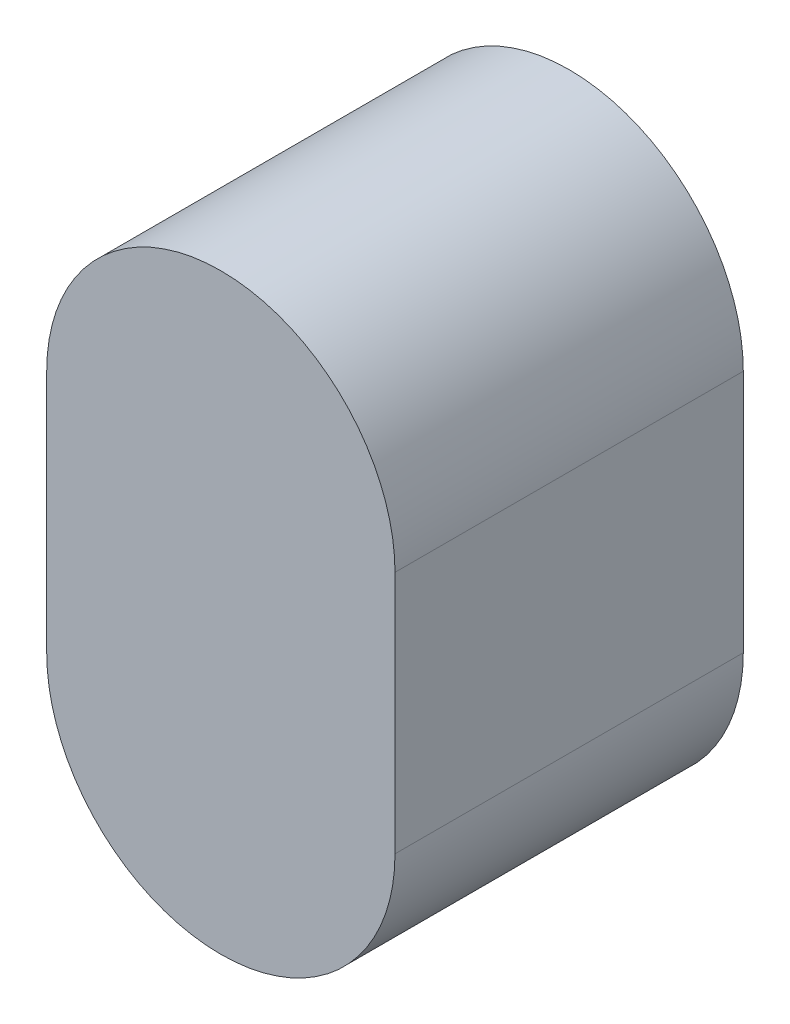
ISO-10303-21;
HEADER;
FILE_DESCRIPTION(('STEP AP214'),'2;1');
FILE_NAME('part.step','',(''),(''),'','','');
FILE_SCHEMA(('AUTOMOTIVE_DESIGN { 1 0 10303 214 1 1 1 1 }'));
ENDSEC;
DATA;
#1=APPLICATION_CONTEXT('core data for automotive mechanical design processes');
#2=APPLICATION_PROTOCOL_DEFINITION('international standard','automotive_design',2000,#1);
#3=PRODUCT_CONTEXT('',#1,'mechanical');
#4=PRODUCT('Part','Part','',(#3));
#5=PRODUCT_RELATED_PRODUCT_CATEGORY('part','',(#4));
#6=PRODUCT_DEFINITION_FORMATION('','',#4);
#7=PRODUCT_DEFINITION_CONTEXT('part definition',#1,'design');
#8=PRODUCT_DEFINITION('design','',#6,#7);
#9=PRODUCT_DEFINITION_SHAPE('','',#8);
#10=(LENGTH_UNIT() NAMED_UNIT(*) SI_UNIT(.MILLI.,.METRE.));
#11=(NAMED_UNIT(*) PLANE_ANGLE_UNIT() SI_UNIT($,.RADIAN.));
#12=(NAMED_UNIT(*) SI_UNIT($,.STERADIAN.) SOLID_ANGLE_UNIT());
#13=UNCERTAINTY_MEASURE_WITH_UNIT(LENGTH_MEASURE(1.E-05),#10,'distance_accuracy_value','');
#14=(GEOMETRIC_REPRESENTATION_CONTEXT(3) GLOBAL_UNCERTAINTY_ASSIGNED_CONTEXT((#13)) GLOBAL_UNIT_ASSIGNED_CONTEXT((#10,
#11,#12)) REPRESENTATION_CONTEXT('',''));
#15=CARTESIAN_POINT('',(0.,0.,0.));
#16=DIRECTION('',(0.,0.,1.));
#17=DIRECTION('',(1.,0.,0.));
#18=AXIS2_PLACEMENT_3D('',#15,#16,#17);
#19=CARTESIAN_POINT('',(0.,0.,5.));
#20=DIRECTION('',(0.,0.,-1.));
#21=DIRECTION('',(-1.,0.,0.));
#22=AXIS2_PLACEMENT_3D('',#19,#20,#21);
#23=CYLINDRICAL_SURFACE('',#22,2.5);
#24=CARTESIAN_POINT('',(0.,0.,0.));
#25=DIRECTION('',(0.,0.,1.));
#26=DIRECTION('',(1.,0.,0.));
#27=AXIS2_PLACEMENT_3D('',#24,#25,#26);
#28=CIRCLE('',#27,2.5);
#29=CARTESIAN_POINT('',(-2.5,0.,0.));
#30=VERTEX_POINT('',#29);
#31=CARTESIAN_POINT('',(2.5,0.,0.));
#32=VERTEX_POINT('',#31);
#33=EDGE_CURVE('E96',#30,#32,#28,.T.);
#34=ORIENTED_EDGE('',*,*,#33,.T.);
#35=DIRECTION('',(0.,0.,-1.));
#36=VECTOR('',#35,1.);
#37=CARTESIAN_POINT('',(2.5,0.,5.));
#38=LINE('',#37,#36);
#39=CARTESIAN_POINT('',(2.5,0.,5.));
#40=VERTEX_POINT('',#39);
#41=EDGE_CURVE('E11',#40,#32,#38,.T.);
#42=ORIENTED_EDGE('',*,*,#41,.F.);
#43=CARTESIAN_POINT('',(0.,0.,5.));
#44=DIRECTION('',(0.,0.,1.));
#45=DIRECTION('',(1.,0.,0.));
#46=AXIS2_PLACEMENT_3D('',#43,#44,#45);
#47=CIRCLE('',#46,2.5);
#48=CARTESIAN_POINT('',(-2.5,0.,5.));
#49=VERTEX_POINT('',#48);
#50=EDGE_CURVE('E84',#49,#40,#47,.T.);
#51=ORIENTED_EDGE('',*,*,#50,.F.);
#52=DIRECTION('',(0.,0.,-1.));
#53=VECTOR('',#52,1.);
#54=CARTESIAN_POINT('',(-2.5,0.,5.));
#55=LINE('',#54,#53);
#56=EDGE_CURVE('E92',#49,#30,#55,.T.);
#57=ORIENTED_EDGE('',*,*,#56,.T.);
#58=EDGE_LOOP('',(#34,#42,#51,#57));
#59=FACE_BOUND('',#58,.T.);
#60=ADVANCED_FACE('F33',(#59),#23,.T.);
#61=CARTESIAN_POINT('',(2.5,0.,5.));
#62=DIRECTION('',(-1.,0.,0.));
#63=DIRECTION('',(0.,0.,1.));
#64=AXIS2_PLACEMENT_3D('',#61,#62,#63);
#65=PLANE('',#64);
#66=DIRECTION('',(0.,1.,0.));
#67=VECTOR('',#66,1.);
#68=CARTESIAN_POINT('',(2.5,0.,0.));
#69=LINE('',#68,#67);
#70=CARTESIAN_POINT('',(2.5,3.5,0.));
#71=VERTEX_POINT('',#70);
#72=EDGE_CURVE('E88',#32,#71,#69,.T.);
#73=ORIENTED_EDGE('',*,*,#72,.T.);
#74=DIRECTION('',(0.,0.,-1.));
#75=VECTOR('',#74,1.);
#76=CARTESIAN_POINT('',(2.5,3.5,5.));
#77=LINE('',#76,#75);
#78=CARTESIAN_POINT('',(2.5,3.5,5.));
#79=VERTEX_POINT('',#78);
#80=EDGE_CURVE('E41',#79,#71,#77,.T.);
#81=ORIENTED_EDGE('',*,*,#80,.F.);
#82=DIRECTION('',(0.,1.,0.));
#83=VECTOR('',#82,1.);
#84=CARTESIAN_POINT('',(2.5,0.,5.));
#85=LINE('',#84,#83);
#86=EDGE_CURVE('E79',#40,#79,#85,.T.);
#87=ORIENTED_EDGE('',*,*,#86,.F.);
#88=ORIENTED_EDGE('',*,*,#41,.T.);
#89=EDGE_LOOP('',(#73,#81,#87,#88));
#90=FACE_BOUND('',#89,.T.);
#91=ADVANCED_FACE('F87',(#90),#65,.F.);
#92=CARTESIAN_POINT('',(0.,3.5,5.));
#93=DIRECTION('',(0.,0.,-1.));
#94=DIRECTION('',(-1.,0.,0.));
#95=AXIS2_PLACEMENT_3D('',#92,#93,#94);
#96=CYLINDRICAL_SURFACE('',#95,2.5);
#97=CARTESIAN_POINT('',(0.,3.5,0.));
#98=DIRECTION('',(0.,0.,1.));
#99=DIRECTION('',(1.,0.,0.));
#100=AXIS2_PLACEMENT_3D('',#97,#98,#99);
#101=CIRCLE('',#100,2.5);
#102=CARTESIAN_POINT('',(-2.5,3.5,0.));
#103=VERTEX_POINT('',#102);
#104=EDGE_CURVE('E66',#71,#103,#101,.T.);
#105=ORIENTED_EDGE('',*,*,#104,.T.);
#106=DIRECTION('',(0.,0.,-1.));
#107=VECTOR('',#106,1.);
#108=CARTESIAN_POINT('',(-2.5,3.5,5.));
#109=LINE('',#108,#107);
#110=CARTESIAN_POINT('',(-2.5,3.5,5.));
#111=VERTEX_POINT('',#110);
#112=EDGE_CURVE('E89',#111,#103,#109,.T.);
#113=ORIENTED_EDGE('',*,*,#112,.F.);
#114=CARTESIAN_POINT('',(0.,3.5,5.));
#115=DIRECTION('',(0.,0.,1.));
#116=DIRECTION('',(1.,0.,0.));
#117=AXIS2_PLACEMENT_3D('',#114,#115,#116);
#118=CIRCLE('',#117,2.5);
#119=EDGE_CURVE('E82',#79,#111,#118,.T.);
#120=ORIENTED_EDGE('',*,*,#119,.F.);
#121=ORIENTED_EDGE('',*,*,#80,.T.);
#122=EDGE_LOOP('',(#105,#113,#120,#121));
#123=FACE_BOUND('',#122,.T.);
#124=ADVANCED_FACE('F90',(#123),#96,.T.);
#125=CARTESIAN_POINT('',(-2.5,0.,5.));
#126=DIRECTION('',(1.,0.,0.));
#127=DIRECTION('',(0.,0.,-1.));
#128=AXIS2_PLACEMENT_3D('',#125,#126,#127);
#129=PLANE('',#128);
#130=DIRECTION('',(0.,-1.,0.));
#131=VECTOR('',#130,1.);
#132=CARTESIAN_POINT('',(-2.5,0.,0.));
#133=LINE('',#132,#131);
#134=EDGE_CURVE('E72',#103,#30,#133,.T.);
#135=ORIENTED_EDGE('',*,*,#134,.T.);
#136=ORIENTED_EDGE('',*,*,#56,.F.);
#137=DIRECTION('',(0.,-1.,0.));
#138=VECTOR('',#137,1.);
#139=CARTESIAN_POINT('',(-2.5,0.,5.));
#140=LINE('',#139,#138);
#141=EDGE_CURVE('E49',#111,#49,#140,.T.);
#142=ORIENTED_EDGE('',*,*,#141,.F.);
#143=ORIENTED_EDGE('',*,*,#112,.T.);
#144=EDGE_LOOP('',(#135,#136,#142,#143));
#145=FACE_BOUND('',#144,.T.);
#146=ADVANCED_FACE('F103',(#145),#129,.F.);
#147=CARTESIAN_POINT('',(0.,0.,5.));
#148=DIRECTION('',(0.,0.,1.));
#149=DIRECTION('',(1.,0.,0.));
#150=AXIS2_PLACEMENT_3D('',#147,#148,#149);
#151=PLANE('',#150);
#152=ORIENTED_EDGE('',*,*,#50,.T.);
#153=ORIENTED_EDGE('',*,*,#86,.T.);
#154=ORIENTED_EDGE('',*,*,#119,.T.);
#155=ORIENTED_EDGE('',*,*,#141,.T.);
#156=EDGE_LOOP('',(#152,#153,#154,#155));
#157=FACE_BOUND('',#156,.T.);
#158=ADVANCED_FACE('F80',(#157),#151,.T.);
#159=CARTESIAN_POINT('',(0.,0.,0.));
#160=DIRECTION('',(0.,0.,1.));
#161=DIRECTION('',(1.,0.,0.));
#162=AXIS2_PLACEMENT_3D('',#159,#160,#161);
#163=PLANE('',#162);
#164=ORIENTED_EDGE('',*,*,#33,.F.);
#165=ORIENTED_EDGE('',*,*,#134,.F.);
#166=ORIENTED_EDGE('',*,*,#104,.F.);
#167=ORIENTED_EDGE('',*,*,#72,.F.);
#168=EDGE_LOOP('',(#164,#165,#166,#167));
#169=FACE_BOUND('',#168,.T.);
#170=ADVANCED_FACE('F106',(#169),#163,.F.);
#171=CLOSED_SHELL('',(#60,#91,#124,#146,#158,#170));
#172=MANIFOLD_SOLID_BREP('B2',#171);
#173=ADVANCED_BREP_SHAPE_REPRESENTATION('',(#18,#172),#14);
#174=SHAPE_DEFINITION_REPRESENTATION(#9,#173);
ENDSEC;
END-ISO-10303-21;
